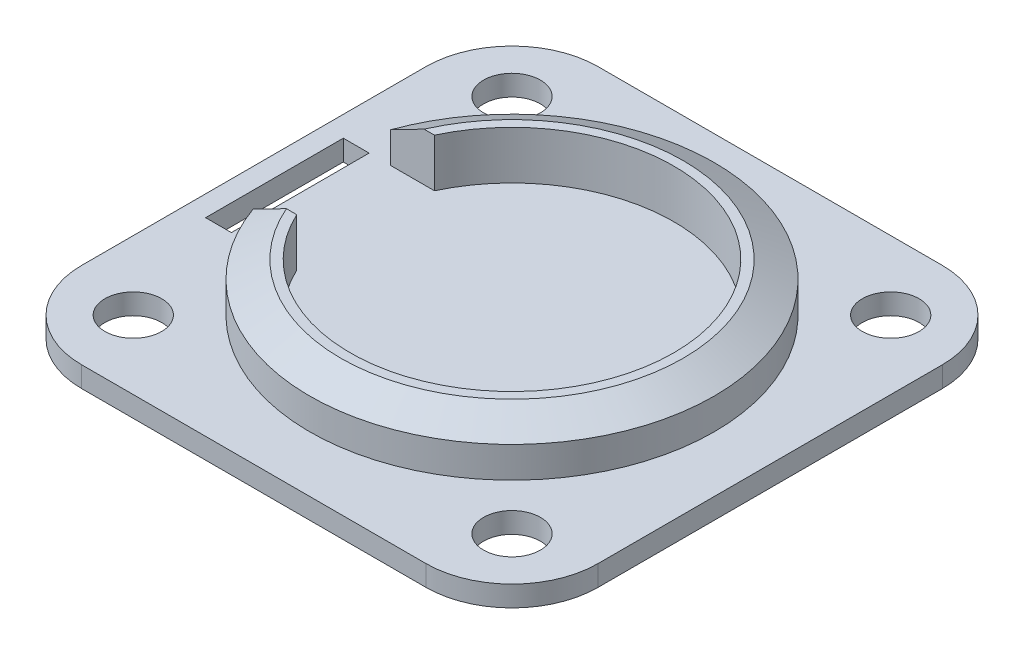
ISO-10303-21;
HEADER;
FILE_DESCRIPTION(('STEP AP214'),'2;1');
FILE_NAME('part.step','',(''),(''),'','','');
FILE_SCHEMA(('AUTOMOTIVE_DESIGN { 1 0 10303 214 1 1 1 1 }'));
ENDSEC;
DATA;
#1=APPLICATION_CONTEXT('core data for automotive mechanical design processes');
#2=APPLICATION_PROTOCOL_DEFINITION('international standard','automotive_design',2000,#1);
#3=PRODUCT_CONTEXT('',#1,'mechanical');
#4=PRODUCT('Part','Part','',(#3));
#5=PRODUCT_RELATED_PRODUCT_CATEGORY('part','',(#4));
#6=PRODUCT_DEFINITION_FORMATION('','',#4);
#7=PRODUCT_DEFINITION_CONTEXT('part definition',#1,'design');
#8=PRODUCT_DEFINITION('design','',#6,#7);
#9=PRODUCT_DEFINITION_SHAPE('','',#8);
#10=(LENGTH_UNIT() NAMED_UNIT(*) SI_UNIT(.MILLI.,.METRE.));
#11=(NAMED_UNIT(*) PLANE_ANGLE_UNIT() SI_UNIT($,.RADIAN.));
#12=(NAMED_UNIT(*) SI_UNIT($,.STERADIAN.) SOLID_ANGLE_UNIT());
#13=UNCERTAINTY_MEASURE_WITH_UNIT(LENGTH_MEASURE(1.E-05),#10,'distance_accuracy_value','');
#14=(GEOMETRIC_REPRESENTATION_CONTEXT(3) GLOBAL_UNCERTAINTY_ASSIGNED_CONTEXT((#13)) GLOBAL_UNIT_ASSIGNED_CONTEXT((#10,
#11,#12)) REPRESENTATION_CONTEXT('',''));
#15=CARTESIAN_POINT('',(0.,0.,0.));
#16=DIRECTION('',(0.,0.,1.));
#17=DIRECTION('',(1.,0.,0.));
#18=AXIS2_PLACEMENT_3D('',#15,#16,#17);
#19=CARTESIAN_POINT('',(0.,1.2,0.));
#20=DIRECTION('',(0.,1.,0.));
#21=DIRECTION('',(0.,0.,1.));
#22=AXIS2_PLACEMENT_3D('',#19,#20,#21);
#23=PLANE('',#22);
#24=CARTESIAN_POINT('',(11.,1.2,-11.));
#25=DIRECTION('',(0.,1.,0.));
#26=DIRECTION('',(0.,0.,1.));
#27=AXIS2_PLACEMENT_3D('',#24,#25,#26);
#28=CIRCLE('',#27,1.65);
#29=CARTESIAN_POINT('',(11.,1.2,-9.35));
#30=VERTEX_POINT('',#29);
#31=EDGE_CURVE('E199',#30,#30,#28,.T.);
#32=ORIENTED_EDGE('',*,*,#31,.F.);
#33=EDGE_LOOP('',(#32));
#34=FACE_BOUND('',#33,.T.);
#35=CARTESIAN_POINT('',(-11.,1.2,11.));
#36=DIRECTION('',(0.,1.,0.));
#37=DIRECTION('',(0.,0.,1.));
#38=AXIS2_PLACEMENT_3D('',#35,#36,#37);
#39=CIRCLE('',#38,1.65);
#40=CARTESIAN_POINT('',(-11.,1.2,12.65));
#41=VERTEX_POINT('',#40);
#42=EDGE_CURVE('E211',#41,#41,#39,.T.);
#43=ORIENTED_EDGE('',*,*,#42,.F.);
#44=EDGE_LOOP('',(#43));
#45=FACE_BOUND('',#44,.T.);
#46=DIRECTION('',(1.,0.,0.));
#47=VECTOR('',#46,1.);
#48=CARTESIAN_POINT('',(-15.,1.2,15.));
#49=LINE('',#48,#47);
#50=CARTESIAN_POINT('',(-10.,1.2,15.));
#51=VERTEX_POINT('',#50);
#52=CARTESIAN_POINT('',(9.99999999999999,1.2,15.));
#53=VERTEX_POINT('',#52);
#54=EDGE_CURVE('E233',#51,#53,#49,.T.);
#55=ORIENTED_EDGE('',*,*,#54,.T.);
#56=CARTESIAN_POINT('',(10.,1.2,10.));
#57=DIRECTION('',(0.,1.,0.));
#58=DIRECTION('',(0.,0.,1.));
#59=AXIS2_PLACEMENT_3D('',#56,#57,#58);
#60=CIRCLE('',#59,5.);
#61=CARTESIAN_POINT('',(15.,1.2,10.));
#62=VERTEX_POINT('',#61);
#63=EDGE_CURVE('E298',#53,#62,#60,.T.);
#64=ORIENTED_EDGE('',*,*,#63,.T.);
#65=DIRECTION('',(0.,0.,-1.));
#66=VECTOR('',#65,1.);
#67=CARTESIAN_POINT('',(15.,1.2,-15.));
#68=LINE('',#67,#66);
#69=CARTESIAN_POINT('',(15.,1.2,-9.99999999999999));
#70=VERTEX_POINT('',#69);
#71=EDGE_CURVE('E223',#62,#70,#68,.T.);
#72=ORIENTED_EDGE('',*,*,#71,.T.);
#73=CARTESIAN_POINT('',(9.99999999999999,1.2,-9.99999999999999));
#74=DIRECTION('',(0.,1.,0.));
#75=DIRECTION('',(0.,0.,1.));
#76=AXIS2_PLACEMENT_3D('',#73,#74,#75);
#77=CIRCLE('',#76,5.);
#78=CARTESIAN_POINT('',(9.99999999999999,1.2,-15.));
#79=VERTEX_POINT('',#78);
#80=EDGE_CURVE('E292',#70,#79,#77,.T.);
#81=ORIENTED_EDGE('',*,*,#80,.T.);
#82=DIRECTION('',(-1.,0.,0.));
#83=VECTOR('',#82,1.);
#84=CARTESIAN_POINT('',(-15.,1.2,-15.));
#85=LINE('',#84,#83);
#86=CARTESIAN_POINT('',(-10.,1.2,-15.));
#87=VERTEX_POINT('',#86);
#88=EDGE_CURVE('E226',#79,#87,#85,.T.);
#89=ORIENTED_EDGE('',*,*,#88,.T.);
#90=CARTESIAN_POINT('',(-10.,1.2,-9.99999999999999));
#91=DIRECTION('',(0.,1.,0.));
#92=DIRECTION('',(0.,0.,1.));
#93=AXIS2_PLACEMENT_3D('',#90,#91,#92);
#94=CIRCLE('',#93,5.);
#95=CARTESIAN_POINT('',(-15.,1.2,-9.99999999999999));
#96=VERTEX_POINT('',#95);
#97=EDGE_CURVE('E294',#87,#96,#94,.T.);
#98=ORIENTED_EDGE('',*,*,#97,.T.);
#99=DIRECTION('',(0.,0.,1.));
#100=VECTOR('',#99,1.);
#101=CARTESIAN_POINT('',(-15.,1.2,-15.));
#102=LINE('',#101,#100);
#103=CARTESIAN_POINT('',(-15.,1.2,10.));
#104=VERTEX_POINT('',#103);
#105=EDGE_CURVE('E230',#96,#104,#102,.T.);
#106=ORIENTED_EDGE('',*,*,#105,.T.);
#107=CARTESIAN_POINT('',(-9.99999999999999,1.2,10.));
#108=DIRECTION('',(0.,1.,0.));
#109=DIRECTION('',(0.,0.,1.));
#110=AXIS2_PLACEMENT_3D('',#107,#108,#109);
#111=CIRCLE('',#110,5.);
#112=EDGE_CURVE('E296',#104,#51,#111,.T.);
#113=ORIENTED_EDGE('',*,*,#112,.T.);
#114=EDGE_LOOP('',(#55,#64,#72,#81,#89,#98,#106,#113));
#115=FACE_BOUND('',#114,.T.);
#116=CARTESIAN_POINT('',(11.,1.2,11.));
#117=DIRECTION('',(0.,1.,0.));
#118=DIRECTION('',(0.,0.,1.));
#119=AXIS2_PLACEMENT_3D('',#116,#117,#118);
#120=CIRCLE('',#119,1.65);
#121=CARTESIAN_POINT('',(11.,1.2,12.65));
#122=VERTEX_POINT('',#121);
#123=EDGE_CURVE('E217',#122,#122,#120,.T.);
#124=ORIENTED_EDGE('',*,*,#123,.F.);
#125=EDGE_LOOP('',(#124));
#126=FACE_BOUND('',#125,.T.);
#127=CARTESIAN_POINT('',(-11.,1.2,-11.));
#128=DIRECTION('',(0.,1.,0.));
#129=DIRECTION('',(0.,0.,1.));
#130=AXIS2_PLACEMENT_3D('',#127,#128,#129);
#131=CIRCLE('',#130,1.65);
#132=CARTESIAN_POINT('',(-11.,1.2,-9.35));
#133=VERTEX_POINT('',#132);
#134=EDGE_CURVE('E205',#133,#133,#131,.T.);
#135=ORIENTED_EDGE('',*,*,#134,.F.);
#136=EDGE_LOOP('',(#135));
#137=FACE_BOUND('',#136,.T.);
#138=CARTESIAN_POINT('',(0.,1.2,0.));
#139=DIRECTION('',(0.,1.,0.));
#140=DIRECTION('',(0.,0.,1.));
#141=AXIS2_PLACEMENT_3D('',#138,#139,#140);
#142=CIRCLE('',#141,11.75);
#143=CARTESIAN_POINT('',(-11.0481898969922,1.2,4.));
#144=VERTEX_POINT('',#143);
#145=CARTESIAN_POINT('',(-11.0481898969922,1.2,-4.));
#146=VERTEX_POINT('',#145);
#147=EDGE_CURVE('E252',#144,#146,#142,.T.);
#148=ORIENTED_EDGE('',*,*,#147,.F.);
#149=DIRECTION('',(-1.,0.,0.));
#150=VECTOR('',#149,1.);
#151=CARTESIAN_POINT('',(-15.4734504340804,1.2,4.));
#152=LINE('',#151,#150);
#153=CARTESIAN_POINT('',(-8.5064681272547,1.2,4.));
#154=VERTEX_POINT('',#153);
#155=EDGE_CURVE('E249',#154,#144,#152,.T.);
#156=ORIENTED_EDGE('',*,*,#155,.F.);
#157=CARTESIAN_POINT('',(0.,1.2,0.));
#158=DIRECTION('',(0.,1.,0.));
#159=DIRECTION('',(0.,0.,1.));
#160=AXIS2_PLACEMENT_3D('',#157,#158,#159);
#161=CIRCLE('',#160,9.4);
#162=CARTESIAN_POINT('',(-8.5064681272547,1.2,-4.));
#163=VERTEX_POINT('',#162);
#164=EDGE_CURVE('E271',#163,#154,#161,.F.);
#165=ORIENTED_EDGE('',*,*,#164,.F.);
#166=DIRECTION('',(1.,0.,0.));
#167=VECTOR('',#166,1.);
#168=CARTESIAN_POINT('',(-8.5064681272547,1.2,-4.));
#169=LINE('',#168,#167);
#170=EDGE_CURVE('E236',#146,#163,#169,.T.);
#171=ORIENTED_EDGE('',*,*,#170,.F.);
#172=EDGE_LOOP('',(#148,#156,#165,#171));
#173=FACE_BOUND('',#172,.T.);
#174=DIRECTION('',(1.,0.,0.));
#175=VECTOR('',#174,1.);
#176=CARTESIAN_POINT('',(0.,1.2,-4.00000000000001));
#177=LINE('',#176,#175);
#178=CARTESIAN_POINT('',(-13.8,1.2,-4.00000000000001));
#179=VERTEX_POINT('',#178);
#180=CARTESIAN_POINT('',(-12.3,1.2,-4.00000000000001));
#181=VERTEX_POINT('',#180);
#182=EDGE_CURVE('E195',#179,#181,#177,.T.);
#183=ORIENTED_EDGE('',*,*,#182,.T.);
#184=DIRECTION('',(0.,0.,1.));
#185=VECTOR('',#184,1.);
#186=CARTESIAN_POINT('',(-12.3,1.2,0.));
#187=LINE('',#186,#185);
#188=CARTESIAN_POINT('',(-12.3,1.2,3.99999999999999));
#189=VERTEX_POINT('',#188);
#190=EDGE_CURVE('E162',#181,#189,#187,.T.);
#191=ORIENTED_EDGE('',*,*,#190,.T.);
#192=DIRECTION('',(-1.,0.,0.));
#193=VECTOR('',#192,1.);
#194=CARTESIAN_POINT('',(0.,1.2,3.99999999999999));
#195=LINE('',#194,#193);
#196=CARTESIAN_POINT('',(-13.8,1.2,3.99999999999999));
#197=VERTEX_POINT('',#196);
#198=EDGE_CURVE('E165',#189,#197,#195,.T.);
#199=ORIENTED_EDGE('',*,*,#198,.T.);
#200=DIRECTION('',(0.,0.,-1.));
#201=VECTOR('',#200,1.);
#202=CARTESIAN_POINT('',(-13.8,1.2,0.));
#203=LINE('',#202,#201);
#204=EDGE_CURVE('E192',#197,#179,#203,.T.);
#205=ORIENTED_EDGE('',*,*,#204,.T.);
#206=EDGE_LOOP('',(#183,#191,#199,#205));
#207=FACE_BOUND('',#206,.T.);
#208=ADVANCED_FACE('F32',(#34,#45,#115,#126,#137,#173,#207),#23,.T.);
#209=CARTESIAN_POINT('',(0.,0.,0.));
#210=DIRECTION('',(0.,1.,0.));
#211=DIRECTION('',(0.,0.,1.));
#212=AXIS2_PLACEMENT_3D('',#209,#210,#211);
#213=PLANE('',#212);
#214=CARTESIAN_POINT('',(11.,0.,-11.));
#215=DIRECTION('',(0.,1.,0.));
#216=DIRECTION('',(0.,0.,1.));
#217=AXIS2_PLACEMENT_3D('',#214,#215,#216);
#218=CIRCLE('',#217,1.65);
#219=CARTESIAN_POINT('',(11.,0.,-9.35));
#220=VERTEX_POINT('',#219);
#221=EDGE_CURVE('E198',#220,#220,#218,.T.);
#222=ORIENTED_EDGE('',*,*,#221,.T.);
#223=EDGE_LOOP('',(#222));
#224=FACE_BOUND('',#223,.T.);
#225=CARTESIAN_POINT('',(-11.,0.,-11.));
#226=DIRECTION('',(0.,1.,0.));
#227=DIRECTION('',(0.,0.,1.));
#228=AXIS2_PLACEMENT_3D('',#225,#226,#227);
#229=CIRCLE('',#228,1.65);
#230=CARTESIAN_POINT('',(-11.,0.,-9.35));
#231=VERTEX_POINT('',#230);
#232=EDGE_CURVE('E202',#231,#231,#229,.T.);
#233=ORIENTED_EDGE('',*,*,#232,.T.);
#234=EDGE_LOOP('',(#233));
#235=FACE_BOUND('',#234,.T.);
#236=CARTESIAN_POINT('',(-11.,0.,11.));
#237=DIRECTION('',(0.,1.,0.));
#238=DIRECTION('',(0.,0.,1.));
#239=AXIS2_PLACEMENT_3D('',#236,#237,#238);
#240=CIRCLE('',#239,1.65);
#241=CARTESIAN_POINT('',(-11.,0.,12.65));
#242=VERTEX_POINT('',#241);
#243=EDGE_CURVE('E208',#242,#242,#240,.T.);
#244=ORIENTED_EDGE('',*,*,#243,.T.);
#245=EDGE_LOOP('',(#244));
#246=FACE_BOUND('',#245,.T.);
#247=CARTESIAN_POINT('',(11.,0.,11.));
#248=DIRECTION('',(0.,1.,0.));
#249=DIRECTION('',(0.,0.,1.));
#250=AXIS2_PLACEMENT_3D('',#247,#248,#249);
#251=CIRCLE('',#250,1.65);
#252=CARTESIAN_POINT('',(11.,0.,12.65));
#253=VERTEX_POINT('',#252);
#254=EDGE_CURVE('E214',#253,#253,#251,.T.);
#255=ORIENTED_EDGE('',*,*,#254,.T.);
#256=EDGE_LOOP('',(#255));
#257=FACE_BOUND('',#256,.T.);
#258=DIRECTION('',(0.,0.,-1.));
#259=VECTOR('',#258,1.);
#260=CARTESIAN_POINT('',(15.,0.,-15.));
#261=LINE('',#260,#259);
#262=CARTESIAN_POINT('',(15.,0.,10.));
#263=VERTEX_POINT('',#262);
#264=CARTESIAN_POINT('',(15.,0.,-9.99999999999999));
#265=VERTEX_POINT('',#264);
#266=EDGE_CURVE('E220',#263,#265,#261,.T.);
#267=ORIENTED_EDGE('',*,*,#266,.F.);
#268=CARTESIAN_POINT('',(10.,0.,10.));
#269=DIRECTION('',(0.,1.,0.));
#270=DIRECTION('',(0.,0.,1.));
#271=AXIS2_PLACEMENT_3D('',#268,#269,#270);
#272=CIRCLE('',#271,5.);
#273=CARTESIAN_POINT('',(9.99999999999999,0.,15.));
#274=VERTEX_POINT('',#273);
#275=EDGE_CURVE('E285',#263,#274,#272,.F.);
#276=ORIENTED_EDGE('',*,*,#275,.T.);
#277=DIRECTION('',(1.,0.,0.));
#278=VECTOR('',#277,1.);
#279=CARTESIAN_POINT('',(-15.,0.,15.));
#280=LINE('',#279,#278);
#281=CARTESIAN_POINT('',(-10.,0.,15.));
#282=VERTEX_POINT('',#281);
#283=EDGE_CURVE('E227',#282,#274,#280,.T.);
#284=ORIENTED_EDGE('',*,*,#283,.F.);
#285=CARTESIAN_POINT('',(-9.99999999999999,0.,10.));
#286=DIRECTION('',(0.,1.,0.));
#287=DIRECTION('',(0.,0.,1.));
#288=AXIS2_PLACEMENT_3D('',#285,#286,#287);
#289=CIRCLE('',#288,5.);
#290=CARTESIAN_POINT('',(-15.,0.,10.));
#291=VERTEX_POINT('',#290);
#292=EDGE_CURVE('E283',#282,#291,#289,.F.);
#293=ORIENTED_EDGE('',*,*,#292,.T.);
#294=DIRECTION('',(0.,0.,1.));
#295=VECTOR('',#294,1.);
#296=CARTESIAN_POINT('',(-15.,0.,-15.));
#297=LINE('',#296,#295);
#298=CARTESIAN_POINT('',(-15.,0.,-9.99999999999999));
#299=VERTEX_POINT('',#298);
#300=EDGE_CURVE('E242',#299,#291,#297,.T.);
#301=ORIENTED_EDGE('',*,*,#300,.F.);
#302=CARTESIAN_POINT('',(-10.,0.,-9.99999999999999));
#303=DIRECTION('',(0.,1.,0.));
#304=DIRECTION('',(0.,0.,1.));
#305=AXIS2_PLACEMENT_3D('',#302,#303,#304);
#306=CIRCLE('',#305,5.);
#307=CARTESIAN_POINT('',(-10.,0.,-15.));
#308=VERTEX_POINT('',#307);
#309=EDGE_CURVE('E281',#299,#308,#306,.F.);
#310=ORIENTED_EDGE('',*,*,#309,.T.);
#311=DIRECTION('',(-1.,0.,0.));
#312=VECTOR('',#311,1.);
#313=CARTESIAN_POINT('',(-15.,0.,-15.));
#314=LINE('',#313,#312);
#315=CARTESIAN_POINT('',(9.99999999999999,0.,-15.));
#316=VERTEX_POINT('',#315);
#317=EDGE_CURVE('E239',#316,#308,#314,.T.);
#318=ORIENTED_EDGE('',*,*,#317,.F.);
#319=CARTESIAN_POINT('',(9.99999999999999,0.,-9.99999999999999));
#320=DIRECTION('',(0.,1.,0.));
#321=DIRECTION('',(0.,0.,1.));
#322=AXIS2_PLACEMENT_3D('',#319,#320,#321);
#323=CIRCLE('',#322,5.);
#324=EDGE_CURVE('E279',#316,#265,#323,.F.);
#325=ORIENTED_EDGE('',*,*,#324,.T.);
#326=EDGE_LOOP('',(#267,#276,#284,#293,#301,#310,#318,#325));
#327=FACE_BOUND('',#326,.T.);
#328=DIRECTION('',(0.,0.,-1.));
#329=VECTOR('',#328,1.);
#330=CARTESIAN_POINT('',(-12.3,0.,-4.00000000000001));
#331=LINE('',#330,#329);
#332=CARTESIAN_POINT('',(-12.3,0.,3.99999999999999));
#333=VERTEX_POINT('',#332);
#334=CARTESIAN_POINT('',(-12.3,0.,-4.00000000000001));
#335=VERTEX_POINT('',#334);
#336=EDGE_CURVE('E159',#333,#335,#331,.T.);
#337=ORIENTED_EDGE('',*,*,#336,.T.);
#338=DIRECTION('',(-1.,0.,0.));
#339=VECTOR('',#338,1.);
#340=CARTESIAN_POINT('',(-13.8,0.,-4.00000000000001));
#341=LINE('',#340,#339);
#342=CARTESIAN_POINT('',(-13.8,0.,-4.00000000000001));
#343=VERTEX_POINT('',#342);
#344=EDGE_CURVE('E169',#335,#343,#341,.T.);
#345=ORIENTED_EDGE('',*,*,#344,.T.);
#346=DIRECTION('',(0.,0.,1.));
#347=VECTOR('',#346,1.);
#348=CARTESIAN_POINT('',(-13.8,0.,-4.00000000000001));
#349=LINE('',#348,#347);
#350=CARTESIAN_POINT('',(-13.8,0.,3.99999999999999));
#351=VERTEX_POINT('',#350);
#352=EDGE_CURVE('E175',#343,#351,#349,.T.);
#353=ORIENTED_EDGE('',*,*,#352,.T.);
#354=DIRECTION('',(1.,0.,0.));
#355=VECTOR('',#354,1.);
#356=CARTESIAN_POINT('',(-13.8,0.,3.99999999999999));
#357=LINE('',#356,#355);
#358=EDGE_CURVE('E180',#351,#333,#357,.T.);
#359=ORIENTED_EDGE('',*,*,#358,.T.);
#360=EDGE_LOOP('',(#337,#345,#353,#359));
#361=FACE_BOUND('',#360,.T.);
#362=ADVANCED_FACE('F178',(#224,#235,#246,#257,#327,#361),#213,.F.);
#363=CARTESIAN_POINT('',(0.,4.,0.));
#364=DIRECTION('',(0.,-1.,0.));
#365=DIRECTION('',(0.,0.,-1.));
#366=AXIS2_PLACEMENT_3D('',#363,#364,#365);
#367=CYLINDRICAL_SURFACE('',#366,11.75);
#368=DIRECTION('',(0.,-1.,0.));
#369=VECTOR('',#368,1.);
#370=CARTESIAN_POINT('',(-11.0481898969922,4.,-4.));
#371=LINE('',#370,#369);
#372=CARTESIAN_POINT('',(-11.0481898969922,2.99999999999999,-4.));
#373=VERTEX_POINT('',#372);
#374=EDGE_CURVE('E266',#146,#373,#371,.F.);
#375=ORIENTED_EDGE('',*,*,#374,.T.);
#376=CARTESIAN_POINT('',(0.,2.99999999999999,0.));
#377=DIRECTION('',(0.,1.,0.));
#378=DIRECTION('',(0.,0.,1.));
#379=AXIS2_PLACEMENT_3D('',#376,#377,#378);
#380=CIRCLE('',#379,11.75);
#381=CARTESIAN_POINT('',(-11.0481898969922,2.99999999999999,4.));
#382=VERTEX_POINT('',#381);
#383=EDGE_CURVE('E45',#373,#382,#380,.F.);
#384=ORIENTED_EDGE('',*,*,#383,.T.);
#385=DIRECTION('',(0.,-1.,0.));
#386=VECTOR('',#385,1.);
#387=CARTESIAN_POINT('',(-11.0481898969922,4.,4.));
#388=LINE('',#387,#386);
#389=EDGE_CURVE('E269',#382,#144,#388,.T.);
#390=ORIENTED_EDGE('',*,*,#389,.T.);
#391=ORIENTED_EDGE('',*,*,#147,.T.);
#392=EDGE_LOOP('',(#375,#384,#390,#391));
#393=FACE_BOUND('',#392,.T.);
#394=ADVANCED_FACE('F332',(#393),#367,.T.);
#395=CARTESIAN_POINT('',(0.,4.,0.));
#396=DIRECTION('',(0.,1.,0.));
#397=DIRECTION('',(0.,0.,1.));
#398=AXIS2_PLACEMENT_3D('',#395,#396,#397);
#399=PLANE('',#398);
#400=DIRECTION('',(1.,0.,0.));
#401=VECTOR('',#400,1.);
#402=CARTESIAN_POINT('',(-15.4734504340804,4.,4.));
#403=LINE('',#402,#401);
#404=CARTESIAN_POINT('',(-9.10614990291843,4.,4.));
#405=VERTEX_POINT('',#404);
#406=CARTESIAN_POINT('',(-8.5064681272547,4.,4.));
#407=VERTEX_POINT('',#406);
#408=EDGE_CURVE('E260',#405,#407,#403,.T.);
#409=ORIENTED_EDGE('',*,*,#408,.F.);
#410=CARTESIAN_POINT('',(0.,4.,0.));
#411=DIRECTION('',(0.,1.,0.));
#412=DIRECTION('',(0.,0.,1.));
#413=AXIS2_PLACEMENT_3D('',#410,#411,#412);
#414=CIRCLE('',#413,9.94595224472857);
#415=CARTESIAN_POINT('',(-9.10614990291843,4.,-4.));
#416=VERTEX_POINT('',#415);
#417=EDGE_CURVE('E310',#405,#416,#414,.T.);
#418=ORIENTED_EDGE('',*,*,#417,.T.);
#419=DIRECTION('',(-1.,0.,0.));
#420=VECTOR('',#419,1.);
#421=CARTESIAN_POINT('',(-8.5064681272547,4.,-4.));
#422=LINE('',#421,#420);
#423=CARTESIAN_POINT('',(-8.5064681272547,4.,-4.));
#424=VERTEX_POINT('',#423);
#425=EDGE_CURVE('E258',#424,#416,#422,.T.);
#426=ORIENTED_EDGE('',*,*,#425,.F.);
#427=CARTESIAN_POINT('',(0.,4.,0.));
#428=DIRECTION('',(0.,1.,0.));
#429=DIRECTION('',(0.,0.,1.));
#430=AXIS2_PLACEMENT_3D('',#427,#428,#429);
#431=CIRCLE('',#430,9.4);
#432=EDGE_CURVE('E255',#407,#424,#431,.T.);
#433=ORIENTED_EDGE('',*,*,#432,.F.);
#434=EDGE_LOOP('',(#409,#418,#426,#433));
#435=FACE_BOUND('',#434,.T.);
#436=ADVANCED_FACE('F329',(#435),#399,.T.);
#437=CARTESIAN_POINT('',(-15.4734504340804,0.,4.));
#438=DIRECTION('',(0.,0.,1.));
#439=DIRECTION('',(1.,0.,0.));
#440=AXIS2_PLACEMENT_3D('',#437,#438,#439);
#441=PLANE('',#440);
#442=ORIENTED_EDGE('',*,*,#389,.F.);
#443=CARTESIAN_POINT('',(-11.0481898969922,2.99999999999999,4.));
#444=CARTESIAN_POINT('',(-10.8867659223836,3.08413279474192,4.));
#445=CARTESIAN_POINT('',(-10.7252555109468,3.16810001230862,4.));
#446=CARTESIAN_POINT('',(-10.402038537717,3.33565315370655,4.));
#447=CARTESIAN_POINT('',(-10.2403319773529,3.41923908029473,4.));
#448=CARTESIAN_POINT('',(-9.9166968223936,3.58598085937937,4.));
#449=CARTESIAN_POINT('',(-9.75476822742859,3.66913671115855,4.));
#450=CARTESIAN_POINT('',(-9.43065703840661,3.83495476147456,4.));
#451=CARTESIAN_POINT('',(-9.26847444251655,3.91761695642782,4.));
#452=CARTESIAN_POINT('',(-9.10614990291843,4.,4.));
#453=B_SPLINE_CURVE_WITH_KNOTS('',3,(#443,#444,#445,#446,#447,#448,#449,#450,#451,#452),
.UNSPECIFIED.,.F.,.F.,(4,2,2,2,4),(0.,0.546099192851022,1.09219443081753,1.63829057928786,
2.18439068718983),.UNSPECIFIED.);
#454=EDGE_CURVE('E11',#382,#405,#453,.T.);
#455=ORIENTED_EDGE('',*,*,#454,.T.);
#456=ORIENTED_EDGE('',*,*,#408,.T.);
#457=DIRECTION('',(0.,1.,0.));
#458=VECTOR('',#457,1.);
#459=CARTESIAN_POINT('',(-8.5064681272547,0.,4.));
#460=LINE('',#459,#458);
#461=EDGE_CURVE('E263',#154,#407,#460,.T.);
#462=ORIENTED_EDGE('',*,*,#461,.F.);
#463=ORIENTED_EDGE('',*,*,#155,.T.);
#464=EDGE_LOOP('',(#442,#455,#456,#462,#463));
#465=FACE_BOUND('',#464,.T.);
#466=ADVANCED_FACE('F322',(#465),#441,.F.);
#467=CARTESIAN_POINT('',(-8.5064681272547,0.,-4.));
#468=DIRECTION('',(0.,0.,-1.));
#469=DIRECTION('',(-1.,0.,0.));
#470=AXIS2_PLACEMENT_3D('',#467,#468,#469);
#471=PLANE('',#470);
#472=ORIENTED_EDGE('',*,*,#425,.T.);
#473=CARTESIAN_POINT('',(-9.10614990291843,4.,-4.));
#474=CARTESIAN_POINT('',(-9.26847444251655,3.91761695642782,-4.));
#475=CARTESIAN_POINT('',(-9.43065703840661,3.83495476147456,-4.));
#476=CARTESIAN_POINT('',(-9.75476822742859,3.66913671115855,-4.));
#477=CARTESIAN_POINT('',(-9.9166968223936,3.58598085937937,-4.));
#478=CARTESIAN_POINT('',(-10.2403319773529,3.41923908029473,-4.));
#479=CARTESIAN_POINT('',(-10.402038537717,3.33565315370656,-4.));
#480=CARTESIAN_POINT('',(-10.7252555109468,3.16810001230862,-4.));
#481=CARTESIAN_POINT('',(-10.8867659223836,3.08413279474192,-4.));
#482=CARTESIAN_POINT('',(-11.0481898969922,3.,-4.));
#483=B_SPLINE_CURVE_WITH_KNOTS('',3,(#473,#474,#475,#476,#477,#478,#479,#480,#481,#482),
.UNSPECIFIED.,.F.,.F.,(4,2,2,2,4),(0.,0.546100107901969,1.0921962563723,1.63829149433881,
2.18439068718983),.UNSPECIFIED.);
#484=EDGE_CURVE('E59',#416,#373,#483,.T.);
#485=ORIENTED_EDGE('',*,*,#484,.T.);
#486=ORIENTED_EDGE('',*,*,#374,.F.);
#487=ORIENTED_EDGE('',*,*,#170,.T.);
#488=DIRECTION('',(0.,1.,0.));
#489=VECTOR('',#488,1.);
#490=CARTESIAN_POINT('',(-8.5064681272547,0.,-4.));
#491=LINE('',#490,#489);
#492=EDGE_CURVE('E262',#163,#424,#491,.T.);
#493=ORIENTED_EDGE('',*,*,#492,.T.);
#494=EDGE_LOOP('',(#472,#485,#486,#487,#493));
#495=FACE_BOUND('',#494,.T.);
#496=ADVANCED_FACE('F317',(#495),#471,.F.);
#497=CARTESIAN_POINT('',(0.,0.,0.));
#498=DIRECTION('',(0.,1.,0.));
#499=DIRECTION('',(0.,0.,1.));
#500=AXIS2_PLACEMENT_3D('',#497,#498,#499);
#501=CYLINDRICAL_SURFACE('',#500,9.4);
#502=ORIENTED_EDGE('',*,*,#492,.F.);
#503=ORIENTED_EDGE('',*,*,#164,.T.);
#504=ORIENTED_EDGE('',*,*,#461,.T.);
#505=ORIENTED_EDGE('',*,*,#432,.T.);
#506=EDGE_LOOP('',(#502,#503,#504,#505));
#507=FACE_BOUND('',#506,.T.);
#508=ADVANCED_FACE('F321',(#507),#501,.F.);
#509=CARTESIAN_POINT('',(15.,1.2,-15.));
#510=DIRECTION('',(-1.,0.,0.));
#511=DIRECTION('',(0.,0.,1.));
#512=AXIS2_PLACEMENT_3D('',#509,#510,#511);
#513=PLANE('',#512);
#514=ORIENTED_EDGE('',*,*,#71,.F.);
#515=DIRECTION('',(0.,-1.,0.));
#516=VECTOR('',#515,1.);
#517=CARTESIAN_POINT('',(15.,1.2,10.));
#518=LINE('',#517,#516);
#519=EDGE_CURVE('E276',#62,#263,#518,.T.);
#520=ORIENTED_EDGE('',*,*,#519,.T.);
#521=ORIENTED_EDGE('',*,*,#266,.T.);
#522=DIRECTION('',(0.,-1.,0.));
#523=VECTOR('',#522,1.);
#524=CARTESIAN_POINT('',(15.,1.2,-9.99999999999999));
#525=LINE('',#524,#523);
#526=EDGE_CURVE('E274',#265,#70,#525,.F.);
#527=ORIENTED_EDGE('',*,*,#526,.T.);
#528=EDGE_LOOP('',(#514,#520,#521,#527));
#529=FACE_BOUND('',#528,.T.);
#530=ADVANCED_FACE('F327',(#529),#513,.F.);
#531=CARTESIAN_POINT('',(-15.,1.2,-15.));
#532=DIRECTION('',(0.,0.,1.));
#533=DIRECTION('',(1.,0.,0.));
#534=AXIS2_PLACEMENT_3D('',#531,#532,#533);
#535=PLANE('',#534);
#536=ORIENTED_EDGE('',*,*,#317,.T.);
#537=DIRECTION('',(0.,-1.,0.));
#538=VECTOR('',#537,1.);
#539=CARTESIAN_POINT('',(-10.,1.2,-15.));
#540=LINE('',#539,#538);
#541=EDGE_CURVE('E308',#308,#87,#540,.F.);
#542=ORIENTED_EDGE('',*,*,#541,.T.);
#543=ORIENTED_EDGE('',*,*,#88,.F.);
#544=DIRECTION('',(0.,-1.,0.));
#545=VECTOR('',#544,1.);
#546=CARTESIAN_POINT('',(9.99999999999999,1.2,-15.));
#547=LINE('',#546,#545);
#548=EDGE_CURVE('E305',#79,#316,#547,.T.);
#549=ORIENTED_EDGE('',*,*,#548,.T.);
#550=EDGE_LOOP('',(#536,#542,#543,#549));
#551=FACE_BOUND('',#550,.T.);
#552=ADVANCED_FACE('F377',(#551),#535,.F.);
#553=CARTESIAN_POINT('',(-15.,1.2,-15.));
#554=DIRECTION('',(1.,0.,0.));
#555=DIRECTION('',(0.,0.,-1.));
#556=AXIS2_PLACEMENT_3D('',#553,#554,#555);
#557=PLANE('',#556);
#558=ORIENTED_EDGE('',*,*,#300,.T.);
#559=DIRECTION('',(0.,-1.,0.));
#560=VECTOR('',#559,1.);
#561=CARTESIAN_POINT('',(-15.,1.2,10.));
#562=LINE('',#561,#560);
#563=EDGE_CURVE('E303',#291,#104,#562,.F.);
#564=ORIENTED_EDGE('',*,*,#563,.T.);
#565=ORIENTED_EDGE('',*,*,#105,.F.);
#566=DIRECTION('',(0.,-1.,0.));
#567=VECTOR('',#566,1.);
#568=CARTESIAN_POINT('',(-15.,1.2,-9.99999999999999));
#569=LINE('',#568,#567);
#570=EDGE_CURVE('E300',#96,#299,#569,.T.);
#571=ORIENTED_EDGE('',*,*,#570,.T.);
#572=EDGE_LOOP('',(#558,#564,#565,#571));
#573=FACE_BOUND('',#572,.T.);
#574=ADVANCED_FACE('F373',(#573),#557,.F.);
#575=CARTESIAN_POINT('',(-15.,1.2,15.));
#576=DIRECTION('',(0.,0.,-1.));
#577=DIRECTION('',(-1.,0.,0.));
#578=AXIS2_PLACEMENT_3D('',#575,#576,#577);
#579=PLANE('',#578);
#580=ORIENTED_EDGE('',*,*,#283,.T.);
#581=DIRECTION('',(0.,-1.,0.));
#582=VECTOR('',#581,1.);
#583=CARTESIAN_POINT('',(10.,1.2,15.));
#584=LINE('',#583,#582);
#585=EDGE_CURVE('E290',#274,#53,#584,.F.);
#586=ORIENTED_EDGE('',*,*,#585,.T.);
#587=ORIENTED_EDGE('',*,*,#54,.F.);
#588=DIRECTION('',(0.,-1.,0.));
#589=VECTOR('',#588,1.);
#590=CARTESIAN_POINT('',(-9.99999999999999,1.2,15.));
#591=LINE('',#590,#589);
#592=EDGE_CURVE('E287',#51,#282,#591,.T.);
#593=ORIENTED_EDGE('',*,*,#592,.T.);
#594=EDGE_LOOP('',(#580,#586,#587,#593));
#595=FACE_BOUND('',#594,.T.);
#596=ADVANCED_FACE('F370',(#595),#579,.F.);
#597=CARTESIAN_POINT('',(11.,1.2,11.));
#598=DIRECTION('',(0.,-1.,0.));
#599=DIRECTION('',(0.,0.,-1.));
#600=AXIS2_PLACEMENT_3D('',#597,#598,#599);
#601=CYLINDRICAL_SURFACE('',#600,1.65);
#602=ORIENTED_EDGE('',*,*,#123,.T.);
#603=EDGE_LOOP('',(#602));
#604=FACE_BOUND('',#603,.T.);
#605=ORIENTED_EDGE('',*,*,#254,.F.);
#606=EDGE_LOOP('',(#605));
#607=FACE_BOUND('',#606,.T.);
#608=ADVANCED_FACE('F368',(#604,#607),#601,.F.);
#609=CARTESIAN_POINT('',(-11.,1.2,11.));
#610=DIRECTION('',(0.,-1.,0.));
#611=DIRECTION('',(0.,0.,-1.));
#612=AXIS2_PLACEMENT_3D('',#609,#610,#611);
#613=CYLINDRICAL_SURFACE('',#612,1.65);
#614=ORIENTED_EDGE('',*,*,#42,.T.);
#615=EDGE_LOOP('',(#614));
#616=FACE_BOUND('',#615,.T.);
#617=ORIENTED_EDGE('',*,*,#243,.F.);
#618=EDGE_LOOP('',(#617));
#619=FACE_BOUND('',#618,.T.);
#620=ADVANCED_FACE('F434',(#616,#619),#613,.F.);
#621=CARTESIAN_POINT('',(-11.,1.2,-11.));
#622=DIRECTION('',(0.,-1.,0.));
#623=DIRECTION('',(0.,0.,-1.));
#624=AXIS2_PLACEMENT_3D('',#621,#622,#623);
#625=CYLINDRICAL_SURFACE('',#624,1.65);
#626=ORIENTED_EDGE('',*,*,#134,.T.);
#627=EDGE_LOOP('',(#626));
#628=FACE_BOUND('',#627,.T.);
#629=ORIENTED_EDGE('',*,*,#232,.F.);
#630=EDGE_LOOP('',(#629));
#631=FACE_BOUND('',#630,.T.);
#632=ADVANCED_FACE('F431',(#628,#631),#625,.F.);
#633=CARTESIAN_POINT('',(11.,1.2,-11.));
#634=DIRECTION('',(0.,-1.,0.));
#635=DIRECTION('',(0.,0.,-1.));
#636=AXIS2_PLACEMENT_3D('',#633,#634,#635);
#637=CYLINDRICAL_SURFACE('',#636,1.65);
#638=ORIENTED_EDGE('',*,*,#31,.T.);
#639=EDGE_LOOP('',(#638));
#640=FACE_BOUND('',#639,.T.);
#641=ORIENTED_EDGE('',*,*,#221,.F.);
#642=EDGE_LOOP('',(#641));
#643=FACE_BOUND('',#642,.T.);
#644=ADVANCED_FACE('F343',(#640,#643),#637,.F.);
#645=CARTESIAN_POINT('',(10.,1.2,10.));
#646=DIRECTION('',(0.,-1.,0.));
#647=DIRECTION('',(0.,0.,-1.));
#648=AXIS2_PLACEMENT_3D('',#645,#646,#647);
#649=CYLINDRICAL_SURFACE('',#648,5.);
#650=ORIENTED_EDGE('',*,*,#63,.F.);
#651=ORIENTED_EDGE('',*,*,#585,.F.);
#652=ORIENTED_EDGE('',*,*,#275,.F.);
#653=ORIENTED_EDGE('',*,*,#519,.F.);
#654=EDGE_LOOP('',(#650,#651,#652,#653));
#655=FACE_BOUND('',#654,.T.);
#656=ADVANCED_FACE('F339',(#655),#649,.T.);
#657=CARTESIAN_POINT('',(-9.99999999999999,1.2,10.));
#658=DIRECTION('',(0.,-1.,0.));
#659=DIRECTION('',(0.,0.,-1.));
#660=AXIS2_PLACEMENT_3D('',#657,#658,#659);
#661=CYLINDRICAL_SURFACE('',#660,5.);
#662=ORIENTED_EDGE('',*,*,#112,.F.);
#663=ORIENTED_EDGE('',*,*,#563,.F.);
#664=ORIENTED_EDGE('',*,*,#292,.F.);
#665=ORIENTED_EDGE('',*,*,#592,.F.);
#666=EDGE_LOOP('',(#662,#663,#664,#665));
#667=FACE_BOUND('',#666,.T.);
#668=ADVANCED_FACE('F342',(#667),#661,.T.);
#669=CARTESIAN_POINT('',(-10.,1.2,-9.99999999999999));
#670=DIRECTION('',(0.,-1.,0.));
#671=DIRECTION('',(0.,0.,-1.));
#672=AXIS2_PLACEMENT_3D('',#669,#670,#671);
#673=CYLINDRICAL_SURFACE('',#672,5.);
#674=ORIENTED_EDGE('',*,*,#97,.F.);
#675=ORIENTED_EDGE('',*,*,#541,.F.);
#676=ORIENTED_EDGE('',*,*,#309,.F.);
#677=ORIENTED_EDGE('',*,*,#570,.F.);
#678=EDGE_LOOP('',(#674,#675,#676,#677));
#679=FACE_BOUND('',#678,.T.);
#680=ADVANCED_FACE('F347',(#679),#673,.T.);
#681=CARTESIAN_POINT('',(9.99999999999999,1.2,-9.99999999999999));
#682=DIRECTION('',(0.,-1.,0.));
#683=DIRECTION('',(0.,0.,-1.));
#684=AXIS2_PLACEMENT_3D('',#681,#682,#683);
#685=CYLINDRICAL_SURFACE('',#684,5.);
#686=ORIENTED_EDGE('',*,*,#80,.F.);
#687=ORIENTED_EDGE('',*,*,#526,.F.);
#688=ORIENTED_EDGE('',*,*,#324,.F.);
#689=ORIENTED_EDGE('',*,*,#548,.F.);
#690=EDGE_LOOP('',(#686,#687,#688,#689));
#691=FACE_BOUND('',#690,.T.);
#692=ADVANCED_FACE('F350',(#691),#685,.T.);
#693=CARTESIAN_POINT('',(-12.3,10.,-4.00000000000001));
#694=DIRECTION('',(-1.,0.,0.));
#695=DIRECTION('',(0.,0.,1.));
#696=AXIS2_PLACEMENT_3D('',#693,#694,#695);
#697=PLANE('',#696);
#698=DIRECTION('',(0.,-1.,0.));
#699=VECTOR('',#698,1.);
#700=CARTESIAN_POINT('',(-12.3,10.,-4.00000000000001));
#701=LINE('',#700,#699);
#702=EDGE_CURVE('E154',#181,#335,#701,.T.);
#703=ORIENTED_EDGE('',*,*,#702,.T.);
#704=ORIENTED_EDGE('',*,*,#336,.F.);
#705=DIRECTION('',(0.,-1.,0.));
#706=VECTOR('',#705,1.);
#707=CARTESIAN_POINT('',(-12.3,10.,3.99999999999999));
#708=LINE('',#707,#706);
#709=EDGE_CURVE('E185',#189,#333,#708,.T.);
#710=ORIENTED_EDGE('',*,*,#709,.F.);
#711=ORIENTED_EDGE('',*,*,#190,.F.);
#712=EDGE_LOOP('',(#703,#704,#710,#711));
#713=FACE_BOUND('',#712,.T.);
#714=ADVANCED_FACE('F156',(#713),#697,.T.);
#715=CARTESIAN_POINT('',(-13.8,10.,-4.00000000000001));
#716=DIRECTION('',(0.,0.,1.));
#717=DIRECTION('',(1.,0.,0.));
#718=AXIS2_PLACEMENT_3D('',#715,#716,#717);
#719=PLANE('',#718);
#720=DIRECTION('',(0.,-1.,0.));
#721=VECTOR('',#720,1.);
#722=CARTESIAN_POINT('',(-13.8,10.,-4.00000000000001));
#723=LINE('',#722,#721);
#724=EDGE_CURVE('E166',#179,#343,#723,.T.);
#725=ORIENTED_EDGE('',*,*,#724,.T.);
#726=ORIENTED_EDGE('',*,*,#344,.F.);
#727=ORIENTED_EDGE('',*,*,#702,.F.);
#728=ORIENTED_EDGE('',*,*,#182,.F.);
#729=EDGE_LOOP('',(#725,#726,#727,#728));
#730=FACE_BOUND('',#729,.T.);
#731=ADVANCED_FACE('F170',(#730),#719,.T.);
#732=CARTESIAN_POINT('',(-13.8,10.,-4.00000000000001));
#733=DIRECTION('',(1.,0.,0.));
#734=DIRECTION('',(0.,0.,-1.));
#735=AXIS2_PLACEMENT_3D('',#732,#733,#734);
#736=PLANE('',#735);
#737=DIRECTION('',(0.,-1.,0.));
#738=VECTOR('',#737,1.);
#739=CARTESIAN_POINT('',(-13.8,10.,3.99999999999999));
#740=LINE('',#739,#738);
#741=EDGE_CURVE('E187',#197,#351,#740,.T.);
#742=ORIENTED_EDGE('',*,*,#741,.T.);
#743=ORIENTED_EDGE('',*,*,#352,.F.);
#744=ORIENTED_EDGE('',*,*,#724,.F.);
#745=ORIENTED_EDGE('',*,*,#204,.F.);
#746=EDGE_LOOP('',(#742,#743,#744,#745));
#747=FACE_BOUND('',#746,.T.);
#748=ADVANCED_FACE('F415',(#747),#736,.T.);
#749=CARTESIAN_POINT('',(-13.8,10.,3.99999999999999));
#750=DIRECTION('',(0.,0.,-1.));
#751=DIRECTION('',(-1.,0.,0.));
#752=AXIS2_PLACEMENT_3D('',#749,#750,#751);
#753=PLANE('',#752);
#754=ORIENTED_EDGE('',*,*,#709,.T.);
#755=ORIENTED_EDGE('',*,*,#358,.F.);
#756=ORIENTED_EDGE('',*,*,#741,.F.);
#757=ORIENTED_EDGE('',*,*,#198,.F.);
#758=EDGE_LOOP('',(#754,#755,#756,#757));
#759=FACE_BOUND('',#758,.T.);
#760=ADVANCED_FACE('F417',(#759),#753,.T.);
#761=CARTESIAN_POINT('',(0.,4.,0.));
#762=DIRECTION('',(0.,-1.,0.));
#763=DIRECTION('',(0.,0.,-1.));
#764=AXIS2_PLACEMENT_3D('',#761,#762,#763);
#765=CONICAL_SURFACE('',#764,9.94595224472857,1.06465084371654);
#766=ORIENTED_EDGE('',*,*,#454,.F.);
#767=ORIENTED_EDGE('',*,*,#383,.F.);
#768=ORIENTED_EDGE('',*,*,#484,.F.);
#769=ORIENTED_EDGE('',*,*,#417,.F.);
#770=EDGE_LOOP('',(#766,#767,#768,#769));
#771=FACE_BOUND('',#770,.T.);
#772=ADVANCED_FACE('F34',(#771),#765,.T.);
#773=CLOSED_SHELL('',(#208,#362,#394,#436,#466,#496,#508,#530,#552,#574,#596,#608,#620,#632,
#644,#656,#668,#680,#692,#714,#731,#748,#760,#772));
#774=MANIFOLD_SOLID_BREP('B2',#773);
#775=ADVANCED_BREP_SHAPE_REPRESENTATION('',(#18,#774),#14);
#776=SHAPE_DEFINITION_REPRESENTATION(#9,#775);
ENDSEC;
END-ISO-10303-21;
